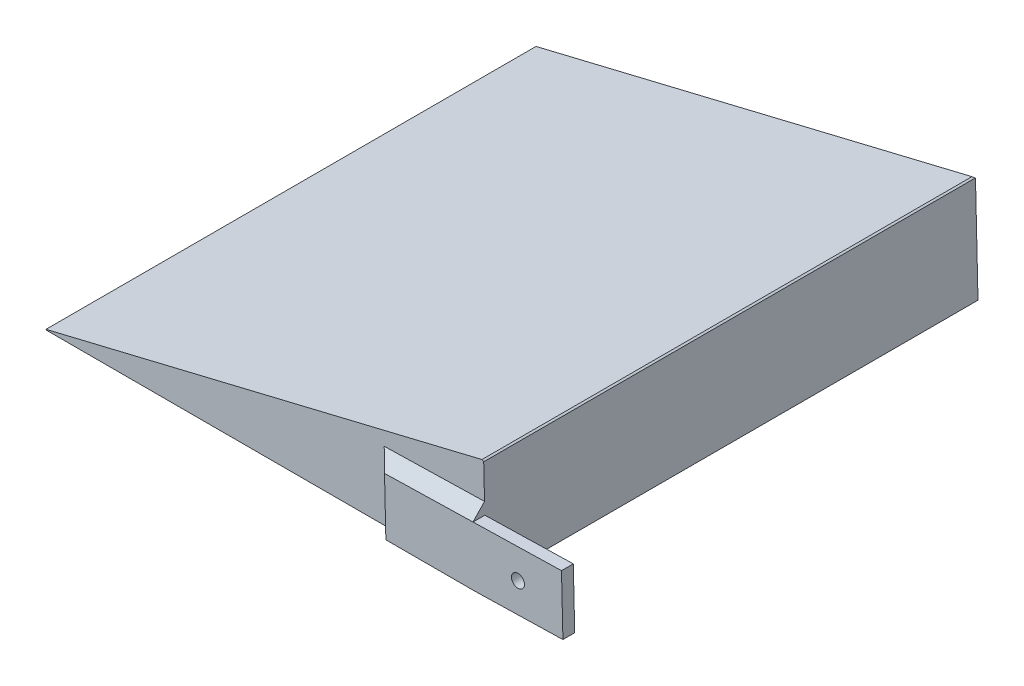
ISO-10303-21;
HEADER;
FILE_DESCRIPTION(('STEP AP214'),'2;1');
FILE_NAME('part.step','',(''),(''),'','','');
FILE_SCHEMA(('AUTOMOTIVE_DESIGN { 1 0 10303 214 1 1 1 1 }'));
ENDSEC;
DATA;
#1=APPLICATION_CONTEXT('core data for automotive mechanical design processes');
#2=APPLICATION_PROTOCOL_DEFINITION('international standard','automotive_design',2000,#1);
#3=PRODUCT_CONTEXT('',#1,'mechanical');
#4=PRODUCT('Part','Part','',(#3));
#5=PRODUCT_RELATED_PRODUCT_CATEGORY('part','',(#4));
#6=PRODUCT_DEFINITION_FORMATION('','',#4);
#7=PRODUCT_DEFINITION_CONTEXT('part definition',#1,'design');
#8=PRODUCT_DEFINITION('design','',#6,#7);
#9=PRODUCT_DEFINITION_SHAPE('','',#8);
#10=(LENGTH_UNIT() NAMED_UNIT(*) SI_UNIT(.MILLI.,.METRE.));
#11=(NAMED_UNIT(*) PLANE_ANGLE_UNIT() SI_UNIT($,.RADIAN.));
#12=(NAMED_UNIT(*) SI_UNIT($,.STERADIAN.) SOLID_ANGLE_UNIT());
#13=UNCERTAINTY_MEASURE_WITH_UNIT(LENGTH_MEASURE(1.E-05),#10,'distance_accuracy_value','');
#14=(GEOMETRIC_REPRESENTATION_CONTEXT(3) GLOBAL_UNCERTAINTY_ASSIGNED_CONTEXT((#13)) GLOBAL_UNIT_ASSIGNED_CONTEXT((#10,
#11,#12)) REPRESENTATION_CONTEXT('',''));
#15=CARTESIAN_POINT('',(0.,0.,0.));
#16=DIRECTION('',(0.,0.,1.));
#17=DIRECTION('',(1.,0.,0.));
#18=AXIS2_PLACEMENT_3D('',#15,#16,#17);
#19=CARTESIAN_POINT('',(0.,0.,0.));
#20=DIRECTION('',(0.,0.,-1.));
#21=DIRECTION('',(-1.,0.,0.));
#22=AXIS2_PLACEMENT_3D('',#19,#20,#21);
#23=PLANE('',#22);
#24=DIRECTION('',(1.,0.,0.));
#25=VECTOR('',#24,1.);
#26=CARTESIAN_POINT('',(-649.855729779263,0.,0.));
#27=LINE('',#26,#25);
#28=CARTESIAN_POINT('',(-648.855729779263,0.,0.));
#29=VERTEX_POINT('',#28);
#30=CARTESIAN_POINT('',(-533.86554298578,0.,0.));
#31=VERTEX_POINT('',#30);
#32=EDGE_CURVE('E232',#29,#31,#27,.T.);
#33=ORIENTED_EDGE('',*,*,#32,.T.);
#34=DIRECTION('',(-0.0240207749117905,0.999711459558525,0.));
#35=VECTOR('',#34,1.);
#36=CARTESIAN_POINT('',(-534.422418002136,23.1763686824038,0.));
#37=LINE('',#36,#35);
#38=CARTESIAN_POINT('',(-534.422418002136,23.1763686824038,0.));
#39=VERTEX_POINT('',#38);
#40=EDGE_CURVE('E281',#31,#39,#37,.T.);
#41=ORIENTED_EDGE('',*,*,#40,.T.);
#42=DIRECTION('',(0.999711459558525,0.0240207749117863,0.));
#43=VECTOR('',#42,1.);
#44=CARTESIAN_POINT('',(-500.432228377146,23.9930750294045,0.));
#45=LINE('',#44,#43);
#46=CARTESIAN_POINT('',(-500.432228377146,23.9930750294045,0.));
#47=VERTEX_POINT('',#46);
#48=EDGE_CURVE('E58',#39,#47,#45,.T.);
#49=ORIENTED_EDGE('',*,*,#48,.T.);
#50=DIRECTION('',(-0.0240207749117887,0.999711459558525,0.));
#51=VECTOR('',#50,1.);
#52=CARTESIAN_POINT('',(-499.855729779263,0.,0.));
#53=LINE('',#52,#51);
#54=CARTESIAN_POINT('',(-500.708352290597,35.4849707550211,0.));
#55=VERTEX_POINT('',#54);
#56=EDGE_CURVE('E227',#47,#55,#53,.T.);
#57=ORIENTED_EDGE('',*,*,#56,.T.);
#58=DIRECTION('',(0.853253577135274,-0.52149624457503,0.));
#59=VECTOR('',#58,1.);
#60=CARTESIAN_POINT('',(-500.708352290597,35.4849707550211,0.));
#61=LINE('',#60,#59);
#62=CARTESIAN_POINT('',(-501.303734628907,35.8488598283699,0.));
#63=VERTEX_POINT('',#62);
#64=EDGE_CURVE('E251',#55,#63,#61,.F.);
#65=ORIENTED_EDGE('',*,*,#64,.T.);
#66=DIRECTION('',(-0.972094921366369,-0.234587859561641,0.));
#67=VECTOR('',#66,1.);
#68=CARTESIAN_POINT('',(-500.720477676087,35.9896125441069,0.));
#69=LINE('',#68,#67);
#70=CARTESIAN_POINT('',(-649.050137011445,0.19440723218174,0.));
#71=VERTEX_POINT('',#70);
#72=EDGE_CURVE('E238',#63,#71,#69,.T.);
#73=ORIENTED_EDGE('',*,*,#72,.T.);
#74=DIRECTION('',(-0.707106781186589,0.707106781186506,0.));
#75=VECTOR('',#74,1.);
#76=CARTESIAN_POINT('',(-649.050137011445,0.19440723218174,0.));
#77=LINE('',#76,#75);
#78=EDGE_CURVE('E269',#71,#29,#77,.F.);
#79=ORIENTED_EDGE('',*,*,#78,.T.);
#80=EDGE_LOOP('',(#33,#41,#49,#57,#65,#73,#79));
#81=FACE_BOUND('',#80,.T.);
#82=ADVANCED_FACE('F43',(#81),#23,.F.);
#83=CARTESIAN_POINT('',(-499.855729779263,0.,-166.666666666667));
#84=DIRECTION('',(0.999711459558526,0.0240207749117887,0.));
#85=DIRECTION('',(-0.0240207749117887,0.999711459558526,0.));
#86=AXIS2_PLACEMENT_3D('',#83,#84,#85);
#87=PLANE('',#86);
#88=DIRECTION('',(0.0171778335846467,-0.714917697202713,-0.698997573858242));
#89=VECTOR('',#88,1.);
#90=CARTESIAN_POINT('',(-500.271039174999,17.2846031697323,-184.355144099582));
#91=LINE('',#90,#89);
#92=CARTESIAN_POINT('',(-500.705732703377,35.3759471547493,-166.666666666667));
#93=VERTEX_POINT('',#92);
#94=CARTESIAN_POINT('',(-500.708352290597,35.4849707550211,-166.560070855175));
#95=VERTEX_POINT('',#94);
#96=EDGE_CURVE('E243',#93,#95,#91,.F.);
#97=ORIENTED_EDGE('',*,*,#96,.T.);
#98=DIRECTION('',(0.,0.,1.));
#99=VECTOR('',#98,1.);
#100=CARTESIAN_POINT('',(-500.708352290597,35.4849707550211,-166.666666666667));
#101=LINE('',#100,#99);
#102=EDGE_CURVE('E248',#95,#55,#101,.T.);
#103=ORIENTED_EDGE('',*,*,#102,.T.);
#104=ORIENTED_EDGE('',*,*,#56,.F.);
#105=DIRECTION('',(-0.0169852528294813,0.706902752283728,-0.707106781186554));
#106=VECTOR('',#105,1.);
#107=CARTESIAN_POINT('',(-500.336145277499,19.9942291911705,4.00000000000003));
#108=LINE('',#107,#106);
#109=CARTESIAN_POINT('',(-500.336145277499,19.9942291911705,4.));
#110=VERTEX_POINT('',#109);
#111=EDGE_CURVE('E279',#47,#110,#108,.F.);
#112=ORIENTED_EDGE('',*,*,#111,.T.);
#113=DIRECTION('',(0.,0.,1.));
#114=VECTOR('',#113,1.);
#115=CARTESIAN_POINT('',(-500.336145277499,19.9942291911705,4.));
#116=LINE('',#115,#114);
#117=CARTESIAN_POINT('',(-500.336145277499,19.9942291911705,0.));
#118=VERTEX_POINT('',#117);
#119=EDGE_CURVE('E275',#118,#110,#116,.T.);
#120=ORIENTED_EDGE('',*,*,#119,.F.);
#121=CARTESIAN_POINT('',(-499.855729779263,0.,0.));
#122=VERTEX_POINT('',#121);
#123=EDGE_CURVE('E235',#122,#118,#53,.T.);
#124=ORIENTED_EDGE('',*,*,#123,.F.);
#125=DIRECTION('',(0.,0.,1.));
#126=VECTOR('',#125,1.);
#127=CARTESIAN_POINT('',(-499.855729779263,0.,-166.666666666667));
#128=LINE('',#127,#126);
#129=CARTESIAN_POINT('',(-499.855729779263,0.,-166.666666666667));
#130=VERTEX_POINT('',#129);
#131=EDGE_CURVE('E234',#130,#122,#128,.T.);
#132=ORIENTED_EDGE('',*,*,#131,.F.);
#133=DIRECTION('',(-0.0240207749117887,0.999711459558525,0.));
#134=VECTOR('',#133,1.);
#135=CARTESIAN_POINT('',(-499.855729779263,0.,-166.666666666667));
#136=LINE('',#135,#134);
#137=EDGE_CURVE('E228',#130,#93,#136,.T.);
#138=ORIENTED_EDGE('',*,*,#137,.T.);
#139=EDGE_LOOP('',(#97,#103,#104,#112,#120,#124,#132,#138));
#140=FACE_BOUND('',#139,.T.);
#141=ADVANCED_FACE('F306',(#140),#87,.T.);
#142=CARTESIAN_POINT('',(-649.855729779263,0.,-166.666666666667));
#143=DIRECTION('',(0.,-1.,0.));
#144=DIRECTION('',(1.,0.,0.));
#145=AXIS2_PLACEMENT_3D('',#142,#143,#144);
#146=PLANE('',#145);
#147=DIRECTION('',(0.,0.,1.));
#148=VECTOR('',#147,1.);
#149=CARTESIAN_POINT('',(-504.857172897868,0.,-252.229551082382));
#150=LINE('',#149,#148);
#151=CARTESIAN_POINT('',(-504.857172897868,0.,-163.666666666667));
#152=VERTEX_POINT('',#151);
#153=CARTESIAN_POINT('',(-504.857172897868,0.,-3.));
#154=VERTEX_POINT('',#153);
#155=EDGE_CURVE('E213',#152,#154,#150,.T.);
#156=ORIENTED_EDGE('',*,*,#155,.F.);
#157=DIRECTION('',(1.,0.,0.));
#158=VECTOR('',#157,1.);
#159=CARTESIAN_POINT('',(-584.857172897868,0.,-163.666666666667));
#160=LINE('',#159,#158);
#161=CARTESIAN_POINT('',(-584.857172897868,0.,-163.666666666667));
#162=VERTEX_POINT('',#161);
#163=EDGE_CURVE('E210',#162,#152,#160,.T.);
#164=ORIENTED_EDGE('',*,*,#163,.F.);
#165=DIRECTION('',(0.,0.,1.));
#166=VECTOR('',#165,1.);
#167=CARTESIAN_POINT('',(-584.857172897868,0.,-252.229551082382));
#168=LINE('',#167,#166);
#169=CARTESIAN_POINT('',(-584.857172897868,0.,-3.));
#170=VERTEX_POINT('',#169);
#171=EDGE_CURVE('E214',#162,#170,#168,.T.);
#172=ORIENTED_EDGE('',*,*,#171,.T.);
#173=DIRECTION('',(1.,0.,0.));
#174=VECTOR('',#173,1.);
#175=CARTESIAN_POINT('',(-584.857172897868,0.,-3.));
#176=LINE('',#175,#174);
#177=EDGE_CURVE('E195',#170,#154,#176,.T.);
#178=ORIENTED_EDGE('',*,*,#177,.T.);
#179=EDGE_LOOP('',(#156,#164,#172,#178));
#180=FACE_BOUND('',#179,.T.);
#181=ORIENTED_EDGE('',*,*,#32,.F.);
#182=DIRECTION('',(0.,0.,-1.));
#183=VECTOR('',#182,1.);
#184=CARTESIAN_POINT('',(-648.855729779263,0.,-166.666666666667));
#185=LINE('',#184,#183);
#186=CARTESIAN_POINT('',(-648.855729779263,0.,-166.301254526228));
#187=VERTEX_POINT('',#186);
#188=EDGE_CURVE('E271',#29,#187,#185,.T.);
#189=ORIENTED_EDGE('',*,*,#188,.T.);
#190=DIRECTION('',(-0.973570249466299,0.,0.228387760955197));
#191=VECTOR('',#190,1.);
#192=CARTESIAN_POINT('',(-649.722318861618,0.,-166.097963248279));
#193=LINE('',#192,#191);
#194=CARTESIAN_POINT('',(-647.298052663656,0.,-166.666666666667));
#195=VERTEX_POINT('',#194);
#196=EDGE_CURVE('E258',#187,#195,#193,.F.);
#197=ORIENTED_EDGE('',*,*,#196,.T.);
#198=DIRECTION('',(1.,0.,0.));
#199=VECTOR('',#198,1.);
#200=CARTESIAN_POINT('',(-649.855729779263,0.,-166.666666666667));
#201=LINE('',#200,#199);
#202=EDGE_CURVE('E231',#195,#130,#201,.T.);
#203=ORIENTED_EDGE('',*,*,#202,.T.);
#204=ORIENTED_EDGE('',*,*,#131,.T.);
#205=DIRECTION('',(0.,0.,-1.));
#206=VECTOR('',#205,1.);
#207=CARTESIAN_POINT('',(-499.855729779263,0.,4.));
#208=LINE('',#207,#206);
#209=CARTESIAN_POINT('',(-499.855729779263,0.,4.));
#210=VERTEX_POINT('',#209);
#211=EDGE_CURVE('E192',#210,#122,#208,.T.);
#212=ORIENTED_EDGE('',*,*,#211,.F.);
#213=DIRECTION('',(1.,0.,0.));
#214=VECTOR('',#213,1.);
#215=CARTESIAN_POINT('',(-499.855729779263,0.,4.));
#216=LINE('',#215,#214);
#217=CARTESIAN_POINT('',(-529.864388490896,0.,4.));
#218=VERTEX_POINT('',#217);
#219=EDGE_CURVE('E170',#218,#210,#216,.T.);
#220=ORIENTED_EDGE('',*,*,#219,.F.);
#221=DIRECTION('',(0.707208802995715,0.,0.707004744655485));
#222=VECTOR('',#221,1.);
#223=CARTESIAN_POINT('',(-529.864388490896,0.,4.00000000000003));
#224=LINE('',#223,#222);
#225=EDGE_CURVE('E52',#218,#31,#224,.F.);
#226=ORIENTED_EDGE('',*,*,#225,.T.);
#227=EDGE_LOOP('',(#181,#189,#197,#203,#204,#212,#220,#226));
#228=FACE_BOUND('',#227,.T.);
#229=ADVANCED_FACE('F285',(#180,#228),#146,.T.);
#230=CARTESIAN_POINT('',(-500.720477676087,35.9896125441069,-166.666666666667));
#231=DIRECTION('',(-0.234587859561641,0.972094921366369,0.));
#232=DIRECTION('',(-0.972094921366369,-0.234587859561641,0.));
#233=AXIS2_PLACEMENT_3D('',#230,#231,#232);
#234=PLANE('',#233);
#235=DIRECTION('',(-0.972094921366369,-0.234587859561641,0.));
#236=VECTOR('',#235,1.);
#237=CARTESIAN_POINT('',(-500.720477676087,35.9896125441069,-166.066666666667));
#238=LINE('',#237,#236);
#239=CARTESIAN_POINT('',(-501.303734628907,35.8488598283699,-166.066666666667));
#240=VERTEX_POINT('',#239);
#241=CARTESIAN_POINT('',(-649.050137011445,0.19440723218174,-166.066666666667));
#242=VERTEX_POINT('',#241);
#243=EDGE_CURVE('E253',#240,#242,#238,.T.);
#244=ORIENTED_EDGE('',*,*,#243,.T.);
#245=DIRECTION('',(0.,0.,1.));
#246=VECTOR('',#245,1.);
#247=CARTESIAN_POINT('',(-649.050137011445,0.194407232181747,-166.666666666667));
#248=LINE('',#247,#246);
#249=EDGE_CURVE('E262',#242,#71,#248,.T.);
#250=ORIENTED_EDGE('',*,*,#249,.T.);
#251=ORIENTED_EDGE('',*,*,#72,.F.);
#252=DIRECTION('',(0.,0.,-1.));
#253=VECTOR('',#252,1.);
#254=CARTESIAN_POINT('',(-501.303734628907,35.8488598283699,-166.666666666667));
#255=LINE('',#254,#253);
#256=EDGE_CURVE('E256',#63,#240,#255,.T.);
#257=ORIENTED_EDGE('',*,*,#256,.T.);
#258=EDGE_LOOP('',(#244,#250,#251,#257));
#259=FACE_BOUND('',#258,.T.);
#260=ADVANCED_FACE('F297',(#259),#234,.T.);
#261=CARTESIAN_POINT('',(0.,0.,-166.666666666667));
#262=DIRECTION('',(0.,0.,-1.));
#263=DIRECTION('',(-1.,0.,0.));
#264=AXIS2_PLACEMENT_3D('',#261,#262,#263);
#265=PLANE('',#264);
#266=CARTESIAN_POINT('',(-513.147814382164,12.,-166.666666666667));
#267=DIRECTION('',(0.,0.,-1.));
#268=DIRECTION('',(-1.,0.,0.));
#269=AXIS2_PLACEMENT_3D('',#266,#267,#268);
#270=CIRCLE('',#269,2.19999999999998);
#271=CARTESIAN_POINT('',(-515.347814382164,12.,-166.666666666667));
#272=VERTEX_POINT('',#271);
#273=EDGE_CURVE('E552',#272,#272,#270,.T.);
#274=ORIENTED_EDGE('',*,*,#273,.F.);
#275=EDGE_LOOP('',(#274));
#276=FACE_BOUND('',#275,.T.);
#277=CARTESIAN_POINT('',(-527.147814382164,12.,-166.666666666667));
#278=DIRECTION('',(0.,0.,-1.));
#279=DIRECTION('',(-1.,0.,0.));
#280=AXIS2_PLACEMENT_3D('',#277,#278,#279);
#281=CIRCLE('',#280,2.19999999999998);
#282=CARTESIAN_POINT('',(-529.347814382164,12.,-166.666666666667));
#283=VERTEX_POINT('',#282);
#284=EDGE_CURVE('E555',#283,#283,#281,.T.);
#285=ORIENTED_EDGE('',*,*,#284,.F.);
#286=EDGE_LOOP('',(#285));
#287=FACE_BOUND('',#286,.T.);
#288=ORIENTED_EDGE('',*,*,#202,.F.);
#289=DIRECTION('',(0.97209492136637,0.234587859561641,0.));
#290=VECTOR('',#289,1.);
#291=CARTESIAN_POINT('',(-35.6217593877383,147.610926906711,-166.666666666667));
#292=LINE('',#291,#290);
#293=EDGE_CURVE('E260',#195,#93,#292,.T.);
#294=ORIENTED_EDGE('',*,*,#293,.T.);
#295=ORIENTED_EDGE('',*,*,#137,.F.);
#296=EDGE_LOOP('',(#288,#294,#295));
#297=FACE_BOUND('',#296,.T.);
#298=ADVANCED_FACE('F312',(#276,#287,#297),#265,.T.);
#299=CARTESIAN_POINT('',(0.,0.,-163.666666666667));
#300=DIRECTION('',(0.,0.,-1.));
#301=DIRECTION('',(-1.,0.,0.));
#302=AXIS2_PLACEMENT_3D('',#299,#300,#301);
#303=PLANE('',#302);
#304=CARTESIAN_POINT('',(-513.147814382164,12.,-163.666666666667));
#305=DIRECTION('',(0.,0.,-1.));
#306=DIRECTION('',(-1.,0.,0.));
#307=AXIS2_PLACEMENT_3D('',#304,#305,#306);
#308=CIRCLE('',#307,2.19999999999998);
#309=CARTESIAN_POINT('',(-515.347814382164,12.,-163.666666666667));
#310=VERTEX_POINT('',#309);
#311=EDGE_CURVE('E558',#310,#310,#308,.F.);
#312=ORIENTED_EDGE('',*,*,#311,.F.);
#313=EDGE_LOOP('',(#312));
#314=FACE_BOUND('',#313,.T.);
#315=CARTESIAN_POINT('',(-527.147814382164,12.,-163.666666666667));
#316=DIRECTION('',(0.,0.,-1.));
#317=DIRECTION('',(-1.,0.,0.));
#318=AXIS2_PLACEMENT_3D('',#315,#316,#317);
#319=CIRCLE('',#318,2.19999999999998);
#320=CARTESIAN_POINT('',(-529.347814382164,12.,-163.666666666667));
#321=VERTEX_POINT('',#320);
#322=EDGE_CURVE('E266',#321,#321,#319,.F.);
#323=ORIENTED_EDGE('',*,*,#322,.F.);
#324=EDGE_LOOP('',(#323));
#325=FACE_BOUND('',#324,.T.);
#326=ORIENTED_EDGE('',*,*,#163,.T.);
#327=DIRECTION('',(-0.0240207749117882,0.999711459558526,0.));
#328=VECTOR('',#327,1.);
#329=CARTESIAN_POINT('',(-504.857172897868,0.,-163.666666666667));
#330=LINE('',#329,#328);
#331=CARTESIAN_POINT('',(-505.570212772658,29.6757342994613,-163.666666666667));
#332=VERTEX_POINT('',#331);
#333=EDGE_CURVE('E198',#152,#332,#330,.T.);
#334=ORIENTED_EDGE('',*,*,#333,.T.);
#335=DIRECTION('',(-0.97209492136637,-0.234587859561641,0.));
#336=VECTOR('',#335,1.);
#337=CARTESIAN_POINT('',(-505.570212772658,29.6757342994613,-163.666666666667));
#338=LINE('',#337,#336);
#339=CARTESIAN_POINT('',(-585.109013894352,10.4812742759377,-163.666666666667));
#340=VERTEX_POINT('',#339);
#341=EDGE_CURVE('E219',#332,#340,#338,.T.);
#342=ORIENTED_EDGE('',*,*,#341,.T.);
#343=DIRECTION('',(0.0240207749117902,-0.999711459558525,0.));
#344=VECTOR('',#343,1.);
#345=CARTESIAN_POINT('',(-585.109013894352,10.4812742759377,-163.666666666667));
#346=LINE('',#345,#344);
#347=EDGE_CURVE('E215',#340,#162,#346,.T.);
#348=ORIENTED_EDGE('',*,*,#347,.T.);
#349=EDGE_LOOP('',(#326,#334,#342,#348));
#350=FACE_BOUND('',#349,.T.);
#351=ADVANCED_FACE('F520',(#314,#325,#350),#303,.F.);
#352=CARTESIAN_POINT('',(0.,0.,-3.));
#353=DIRECTION('',(0.,0.,1.));
#354=DIRECTION('',(1.,0.,0.));
#355=AXIS2_PLACEMENT_3D('',#352,#353,#354);
#356=PLANE('',#355);
#357=ORIENTED_EDGE('',*,*,#177,.F.);
#358=DIRECTION('',(0.0240207749117902,-0.999711459558525,0.));
#359=VECTOR('',#358,1.);
#360=CARTESIAN_POINT('',(-585.109013894352,10.4812742759377,-3.));
#361=LINE('',#360,#359);
#362=CARTESIAN_POINT('',(-585.109013894352,10.4812742759377,-3.));
#363=VERTEX_POINT('',#362);
#364=EDGE_CURVE('E196',#363,#170,#361,.T.);
#365=ORIENTED_EDGE('',*,*,#364,.F.);
#366=DIRECTION('',(-0.972094921366369,-0.234587859561641,0.));
#367=VECTOR('',#366,1.);
#368=CARTESIAN_POINT('',(-505.570212772658,29.6757342994613,-3.));
#369=LINE('',#368,#367);
#370=CARTESIAN_POINT('',(-505.570212772658,29.6757342994613,-3.));
#371=VERTEX_POINT('',#370);
#372=EDGE_CURVE('E199',#371,#363,#369,.T.);
#373=ORIENTED_EDGE('',*,*,#372,.F.);
#374=DIRECTION('',(-0.0240207749117882,0.999711459558525,0.));
#375=VECTOR('',#374,1.);
#376=CARTESIAN_POINT('',(-504.857172897868,0.,-3.));
#377=LINE('',#376,#375);
#378=EDGE_CURVE('E202',#154,#371,#377,.T.);
#379=ORIENTED_EDGE('',*,*,#378,.F.);
#380=EDGE_LOOP('',(#357,#365,#373,#379));
#381=FACE_BOUND('',#380,.T.);
#382=ADVANCED_FACE('F510',(#381),#356,.F.);
#383=CARTESIAN_POINT('',(-504.857172897868,0.,-252.229551082382));
#384=DIRECTION('',(0.999711459558526,0.0240207749117882,0.));
#385=DIRECTION('',(-0.0240207749117882,0.999711459558526,0.));
#386=AXIS2_PLACEMENT_3D('',#383,#384,#385);
#387=PLANE('',#386);
#388=ORIENTED_EDGE('',*,*,#155,.T.);
#389=ORIENTED_EDGE('',*,*,#378,.T.);
#390=DIRECTION('',(0.,0.,1.));
#391=VECTOR('',#390,1.);
#392=CARTESIAN_POINT('',(-505.570212772658,29.6757342994613,-252.229551082382));
#393=LINE('',#392,#391);
#394=EDGE_CURVE('E209',#332,#371,#393,.T.);
#395=ORIENTED_EDGE('',*,*,#394,.F.);
#396=ORIENTED_EDGE('',*,*,#333,.F.);
#397=EDGE_LOOP('',(#388,#389,#395,#396));
#398=FACE_BOUND('',#397,.T.);
#399=ADVANCED_FACE('F500',(#398),#387,.F.);
#400=CARTESIAN_POINT('',(-505.570212772658,29.6757342994613,-252.229551082382));
#401=DIRECTION('',(-0.234587859561641,0.972094921366369,0.));
#402=DIRECTION('',(-0.97209492136637,-0.234587859561641,0.));
#403=AXIS2_PLACEMENT_3D('',#400,#401,#402);
#404=PLANE('',#403);
#405=ORIENTED_EDGE('',*,*,#394,.T.);
#406=ORIENTED_EDGE('',*,*,#372,.T.);
#407=DIRECTION('',(0.,0.,1.));
#408=VECTOR('',#407,1.);
#409=CARTESIAN_POINT('',(-585.109013894352,10.4812742759377,-252.229551082382));
#410=LINE('',#409,#408);
#411=EDGE_CURVE('E218',#340,#363,#410,.T.);
#412=ORIENTED_EDGE('',*,*,#411,.F.);
#413=ORIENTED_EDGE('',*,*,#341,.F.);
#414=EDGE_LOOP('',(#405,#406,#412,#413));
#415=FACE_BOUND('',#414,.T.);
#416=ADVANCED_FACE('F490',(#415),#404,.F.);
#417=CARTESIAN_POINT('',(-585.109013894352,10.4812742759377,-252.229551082382));
#418=DIRECTION('',(-0.999711459558525,-0.0240207749117902,0.));
#419=DIRECTION('',(0.0240207749117902,-0.999711459558525,0.));
#420=AXIS2_PLACEMENT_3D('',#417,#418,#419);
#421=PLANE('',#420);
#422=ORIENTED_EDGE('',*,*,#411,.T.);
#423=ORIENTED_EDGE('',*,*,#364,.T.);
#424=ORIENTED_EDGE('',*,*,#171,.F.);
#425=ORIENTED_EDGE('',*,*,#347,.F.);
#426=EDGE_LOOP('',(#422,#423,#424,#425));
#427=FACE_BOUND('',#426,.T.);
#428=ADVANCED_FACE('F467',(#427),#421,.F.);
#429=CARTESIAN_POINT('',(-469.864385992507,0.720623247353527,4.));
#430=DIRECTION('',(-0.0240207749117863,0.999711459558525,0.));
#431=DIRECTION('',(-0.999711459558525,-0.0240207749117863,0.));
#432=AXIS2_PLACEMENT_3D('',#429,#430,#431);
#433=PLANE('',#432);
#434=DIRECTION('',(0.999711459558525,0.0240207749117863,0.));
#435=VECTOR('',#434,1.);
#436=CARTESIAN_POINT('',(-469.864385992507,0.720623247353527,0.));
#437=LINE('',#436,#435);
#438=CARTESIAN_POINT('',(-469.864385992507,0.720623247353527,0.));
#439=VERTEX_POINT('',#438);
#440=EDGE_CURVE('E180',#122,#439,#437,.T.);
#441=ORIENTED_EDGE('',*,*,#440,.T.);
#442=DIRECTION('',(0.,0.,-1.));
#443=VECTOR('',#442,1.);
#444=CARTESIAN_POINT('',(-469.864385992507,0.720623247353527,4.));
#445=LINE('',#444,#443);
#446=CARTESIAN_POINT('',(-469.864385992507,0.720623247353527,4.));
#447=VERTEX_POINT('',#446);
#448=EDGE_CURVE('E189',#447,#439,#445,.T.);
#449=ORIENTED_EDGE('',*,*,#448,.F.);
#450=DIRECTION('',(0.999711459558525,0.0240207749117863,0.));
#451=VECTOR('',#450,1.);
#452=CARTESIAN_POINT('',(-469.864385992507,0.720623247353527,4.));
#453=LINE('',#452,#451);
#454=EDGE_CURVE('E172',#210,#447,#453,.T.);
#455=ORIENTED_EDGE('',*,*,#454,.F.);
#456=ORIENTED_EDGE('',*,*,#211,.T.);
#457=EDGE_LOOP('',(#441,#449,#455,#456));
#458=FACE_BOUND('',#457,.T.);
#459=ADVANCED_FACE('F319',(#458),#433,.F.);
#460=CARTESIAN_POINT('',(-470.344801490743,20.714852438524,4.));
#461=DIRECTION('',(-0.999711459558525,-0.0240207749117899,0.));
#462=DIRECTION('',(0.0240207749117899,-0.999711459558525,0.));
#463=AXIS2_PLACEMENT_3D('',#460,#461,#462);
#464=PLANE('',#463);
#465=DIRECTION('',(-0.0240207749117899,0.999711459558525,0.));
#466=VECTOR('',#465,1.);
#467=CARTESIAN_POINT('',(-470.344801490743,20.714852438524,0.));
#468=LINE('',#467,#466);
#469=CARTESIAN_POINT('',(-470.344801490743,20.714852438524,0.));
#470=VERTEX_POINT('',#469);
#471=EDGE_CURVE('E182',#439,#470,#468,.T.);
#472=ORIENTED_EDGE('',*,*,#471,.T.);
#473=DIRECTION('',(0.,0.,-1.));
#474=VECTOR('',#473,1.);
#475=CARTESIAN_POINT('',(-470.344801490743,20.714852438524,4.));
#476=LINE('',#475,#474);
#477=CARTESIAN_POINT('',(-470.344801490743,20.714852438524,4.));
#478=VERTEX_POINT('',#477);
#479=EDGE_CURVE('E179',#478,#470,#476,.T.);
#480=ORIENTED_EDGE('',*,*,#479,.F.);
#481=DIRECTION('',(-0.0240207749117899,0.999711459558525,0.));
#482=VECTOR('',#481,1.);
#483=CARTESIAN_POINT('',(-470.344801490743,20.714852438524,4.));
#484=LINE('',#483,#482);
#485=EDGE_CURVE('E177',#447,#478,#484,.T.);
#486=ORIENTED_EDGE('',*,*,#485,.F.);
#487=ORIENTED_EDGE('',*,*,#448,.T.);
#488=EDGE_LOOP('',(#472,#480,#486,#487));
#489=FACE_BOUND('',#488,.T.);
#490=ADVANCED_FACE('F325',(#489),#464,.F.);
#491=CARTESIAN_POINT('',(-500.336145277499,19.9942291911705,4.));
#492=DIRECTION('',(0.0240207749117863,-0.999711459558525,0.));
#493=DIRECTION('',(0.999711459558525,0.0240207749117863,0.));
#494=AXIS2_PLACEMENT_3D('',#491,#492,#493);
#495=PLANE('',#494);
#496=DIRECTION('',(-0.999711459558525,-0.0240207749117863,0.));
#497=VECTOR('',#496,1.);
#498=CARTESIAN_POINT('',(-500.336145277499,19.9942291911705,0.));
#499=LINE('',#498,#497);
#500=EDGE_CURVE('E168',#470,#118,#499,.T.);
#501=ORIENTED_EDGE('',*,*,#500,.T.);
#502=ORIENTED_EDGE('',*,*,#119,.T.);
#503=DIRECTION('',(-0.999711459558525,-0.0240207749117891,0.));
#504=VECTOR('',#503,1.);
#505=CARTESIAN_POINT('',(-500.336145277499,19.9942291911705,4.));
#506=LINE('',#505,#504);
#507=EDGE_CURVE('E167',#478,#110,#506,.T.);
#508=ORIENTED_EDGE('',*,*,#507,.F.);
#509=ORIENTED_EDGE('',*,*,#479,.T.);
#510=EDGE_LOOP('',(#501,#502,#508,#509));
#511=FACE_BOUND('',#510,.T.);
#512=ADVANCED_FACE('F328',(#511),#495,.F.);
#513=CARTESIAN_POINT('',(0.,0.,4.));
#514=DIRECTION('',(0.,0.,-1.));
#515=DIRECTION('',(-1.,0.,0.));
#516=AXIS2_PLACEMENT_3D('',#513,#514,#515);
#517=PLANE('',#516);
#518=CARTESIAN_POINT('',(-485.100265635003,10.357426219262,4.));
#519=DIRECTION('',(0.,0.,1.));
#520=DIRECTION('',(1.,0.,0.));
#521=AXIS2_PLACEMENT_3D('',#518,#519,#520);
#522=CIRCLE('',#521,2.19999999999998);
#523=CARTESIAN_POINT('',(-482.900265635003,10.357426219262,4.));
#524=VERTEX_POINT('',#523);
#525=EDGE_CURVE('E246',#524,#524,#522,.T.);
#526=ORIENTED_EDGE('',*,*,#525,.F.);
#527=EDGE_LOOP('',(#526));
#528=FACE_BOUND('',#527,.T.);
#529=ORIENTED_EDGE('',*,*,#507,.T.);
#530=CARTESIAN_POINT('',(-530.327489064255,19.2736059438168,4.));
#531=VERTEX_POINT('',#530);
#532=EDGE_CURVE('E157',#110,#531,#506,.T.);
#533=ORIENTED_EDGE('',*,*,#532,.T.);
#534=DIRECTION('',(0.0240207749117905,-0.999711459558525,0.));
#535=VECTOR('',#534,1.);
#536=CARTESIAN_POINT('',(-529.864388490896,0.,4.));
#537=LINE('',#536,#535);
#538=EDGE_CURVE('E165',#531,#218,#537,.T.);
#539=ORIENTED_EDGE('',*,*,#538,.T.);
#540=ORIENTED_EDGE('',*,*,#219,.T.);
#541=ORIENTED_EDGE('',*,*,#454,.T.);
#542=ORIENTED_EDGE('',*,*,#485,.T.);
#543=EDGE_LOOP('',(#529,#533,#539,#540,#541,#542));
#544=FACE_BOUND('',#543,.T.);
#545=ADVANCED_FACE('F164',(#528,#544),#517,.F.);
#546=CARTESIAN_POINT('',(0.,0.,0.));
#547=DIRECTION('',(0.,0.,-1.));
#548=DIRECTION('',(-1.,0.,0.));
#549=AXIS2_PLACEMENT_3D('',#546,#547,#548);
#550=PLANE('',#549);
#551=CARTESIAN_POINT('',(-485.100265635003,10.357426219262,0.));
#552=DIRECTION('',(0.,0.,-1.));
#553=DIRECTION('',(-1.,0.,0.));
#554=AXIS2_PLACEMENT_3D('',#551,#552,#553);
#555=CIRCLE('',#554,2.19999999999998);
#556=CARTESIAN_POINT('',(-487.300265635003,10.357426219262,0.));
#557=VERTEX_POINT('',#556);
#558=EDGE_CURVE('E183',#557,#557,#555,.T.);
#559=ORIENTED_EDGE('',*,*,#558,.F.);
#560=EDGE_LOOP('',(#559));
#561=FACE_BOUND('',#560,.T.);
#562=ORIENTED_EDGE('',*,*,#440,.F.);
#563=ORIENTED_EDGE('',*,*,#123,.T.);
#564=ORIENTED_EDGE('',*,*,#500,.F.);
#565=ORIENTED_EDGE('',*,*,#471,.F.);
#566=EDGE_LOOP('',(#562,#563,#564,#565));
#567=FACE_BOUND('',#566,.T.);
#568=ADVANCED_FACE('F322',(#561,#567),#550,.T.);
#569=CARTESIAN_POINT('',(-485.100265635003,10.357426219262,-166.666666666667));
#570=DIRECTION('',(0.,0.,1.));
#571=DIRECTION('',(1.,0.,0.));
#572=AXIS2_PLACEMENT_3D('',#569,#570,#571);
#573=CYLINDRICAL_SURFACE('',#572,2.19999999999998);
#574=ORIENTED_EDGE('',*,*,#558,.T.);
#575=EDGE_LOOP('',(#574));
#576=FACE_BOUND('',#575,.T.);
#577=ORIENTED_EDGE('',*,*,#525,.T.);
#578=EDGE_LOOP('',(#577));
#579=FACE_BOUND('',#578,.T.);
#580=ADVANCED_FACE('F420',(#576,#579),#573,.F.);
#581=CARTESIAN_POINT('',(-527.147814382164,12.,-157.444126992225));
#582=DIRECTION('',(0.,0.,-1.));
#583=DIRECTION('',(-1.,0.,0.));
#584=AXIS2_PLACEMENT_3D('',#581,#582,#583);
#585=CYLINDRICAL_SURFACE('',#584,2.19999999999998);
#586=ORIENTED_EDGE('',*,*,#322,.T.);
#587=EDGE_LOOP('',(#586));
#588=FACE_BOUND('',#587,.T.);
#589=ORIENTED_EDGE('',*,*,#284,.T.);
#590=EDGE_LOOP('',(#589));
#591=FACE_BOUND('',#590,.T.);
#592=ADVANCED_FACE('F410',(#588,#591),#585,.F.);
#593=CARTESIAN_POINT('',(-513.147814382164,12.,-157.444126992225));
#594=DIRECTION('',(0.,0.,-1.));
#595=DIRECTION('',(-1.,0.,0.));
#596=AXIS2_PLACEMENT_3D('',#593,#594,#595);
#597=CYLINDRICAL_SURFACE('',#596,2.19999999999998);
#598=ORIENTED_EDGE('',*,*,#311,.T.);
#599=EDGE_LOOP('',(#598));
#600=FACE_BOUND('',#599,.T.);
#601=ORIENTED_EDGE('',*,*,#273,.T.);
#602=EDGE_LOOP('',(#601));
#603=FACE_BOUND('',#602,.T.);
#604=ADVANCED_FACE('F364',(#600,#603),#597,.F.);
#605=CARTESIAN_POINT('',(-500.720477676087,35.9896125441069,-166.066666666667));
#606=DIRECTION('',(0.165878666280076,-0.687374910855171,0.707106781186539));
#607=DIRECTION('',(-0.972094921366369,-0.234587859561641,0.));
#608=AXIS2_PLACEMENT_3D('',#605,#606,#607);
#609=PLANE('',#608);
#610=ORIENTED_EDGE('',*,*,#196,.F.);
#611=DIRECTION('',(-0.537907868450408,0.537907868450344,0.64908416258475));
#612=VECTOR('',#611,1.);
#613=CARTESIAN_POINT('',(-616.488869485495,-32.3668602937638,-205.357787515417));
#614=LINE('',#613,#612);
#615=EDGE_CURVE('E273',#187,#242,#614,.T.);
#616=ORIENTED_EDGE('',*,*,#615,.T.);
#617=ORIENTED_EDGE('',*,*,#243,.F.);
#618=DIRECTION('',(0.696678628395314,-0.425799900662168,-0.577350269189608));
#619=VECTOR('',#618,1.);
#620=CARTESIAN_POINT('',(-501.062398072721,35.7013584160089,-166.266666666667));
#621=LINE('',#620,#619);
#622=EDGE_CURVE('E263',#95,#240,#621,.F.);
#623=ORIENTED_EDGE('',*,*,#622,.F.);
#624=ORIENTED_EDGE('',*,*,#96,.F.);
#625=ORIENTED_EDGE('',*,*,#293,.F.);
#626=EDGE_LOOP('',(#610,#616,#617,#623,#624,#625));
#627=FACE_BOUND('',#626,.T.);
#628=ADVANCED_FACE('F293',(#627),#609,.F.);
#629=CARTESIAN_POINT('',(-500.708352290597,35.4849707550211,-166.666666666667));
#630=DIRECTION('',(-0.521496244575029,-0.853253577135274,0.));
#631=DIRECTION('',(0.,0.,1.));
#632=AXIS2_PLACEMENT_3D('',#629,#630,#631);
#633=PLANE('',#632);
#634=ORIENTED_EDGE('',*,*,#622,.T.);
#635=ORIENTED_EDGE('',*,*,#256,.F.);
#636=ORIENTED_EDGE('',*,*,#64,.F.);
#637=ORIENTED_EDGE('',*,*,#102,.F.);
#638=EDGE_LOOP('',(#634,#635,#636,#637));
#639=FACE_BOUND('',#638,.T.);
#640=ADVANCED_FACE('F302',(#639),#633,.F.);
#641=CARTESIAN_POINT('',(-649.050137011445,0.19440723218174,-166.666666666667));
#642=DIRECTION('',(0.707106781186506,0.707106781186589,0.));
#643=DIRECTION('',(0.,0.,1.));
#644=AXIS2_PLACEMENT_3D('',#641,#642,#643);
#645=PLANE('',#644);
#646=ORIENTED_EDGE('',*,*,#615,.F.);
#647=ORIENTED_EDGE('',*,*,#188,.F.);
#648=ORIENTED_EDGE('',*,*,#78,.F.);
#649=ORIENTED_EDGE('',*,*,#249,.F.);
#650=EDGE_LOOP('',(#646,#647,#648,#649));
#651=FACE_BOUND('',#650,.T.);
#652=ADVANCED_FACE('F289',(#651),#645,.F.);
#653=CARTESIAN_POINT('',(-500.336145277499,19.9942291911705,4.00000000000003));
#654=DIRECTION('',(-0.0169852528294799,0.70690275228374,0.707106781186542));
#655=DIRECTION('',(0.999711459558525,0.0240207749117863,0.));
#656=AXIS2_PLACEMENT_3D('',#653,#654,#655);
#657=PLANE('',#656);
#658=ORIENTED_EDGE('',*,*,#111,.F.);
#659=ORIENTED_EDGE('',*,*,#48,.F.);
#660=DIRECTION('',(0.591052081149536,-0.563315279426598,0.577350269189628));
#661=VECTOR('',#660,1.);
#662=CARTESIAN_POINT('',(-520.090166719551,9.51669909734946,14.0000000000002));
#663=LINE('',#662,#661);
#664=EDGE_CURVE('E12',#39,#531,#663,.T.);
#665=ORIENTED_EDGE('',*,*,#664,.T.);
#666=ORIENTED_EDGE('',*,*,#532,.F.);
#667=EDGE_LOOP('',(#658,#659,#665,#666));
#668=FACE_BOUND('',#667,.T.);
#669=ADVANCED_FACE('F156',(#668),#657,.T.);
#670=CARTESIAN_POINT('',(-529.864388490896,0.,4.00000000000003));
#671=DIRECTION('',(-0.706902752283735,-0.0169852528294827,0.707106781186547));
#672=DIRECTION('',(-0.0240207749117905,0.999711459558525,0.));
#673=AXIS2_PLACEMENT_3D('',#670,#671,#672);
#674=PLANE('',#673);
#675=ORIENTED_EDGE('',*,*,#664,.F.);
#676=ORIENTED_EDGE('',*,*,#40,.F.);
#677=ORIENTED_EDGE('',*,*,#225,.F.);
#678=ORIENTED_EDGE('',*,*,#538,.F.);
#679=EDGE_LOOP('',(#675,#676,#677,#678));
#680=FACE_BOUND('',#679,.T.);
#681=ADVANCED_FACE('F46',(#680),#674,.T.);
#682=CLOSED_SHELL('',(#82,#141,#229,#260,#298,#351,#382,#399,#416,#428,#459,#490,#512,#545,#568,
#580,#592,#604,#628,#640,#652,#669,#681));
#683=MANIFOLD_SOLID_BREP('B2',#682);
#684=ADVANCED_BREP_SHAPE_REPRESENTATION('',(#18,#683),#14);
#685=SHAPE_DEFINITION_REPRESENTATION(#9,#684);
ENDSEC;
END-ISO-10303-21;
